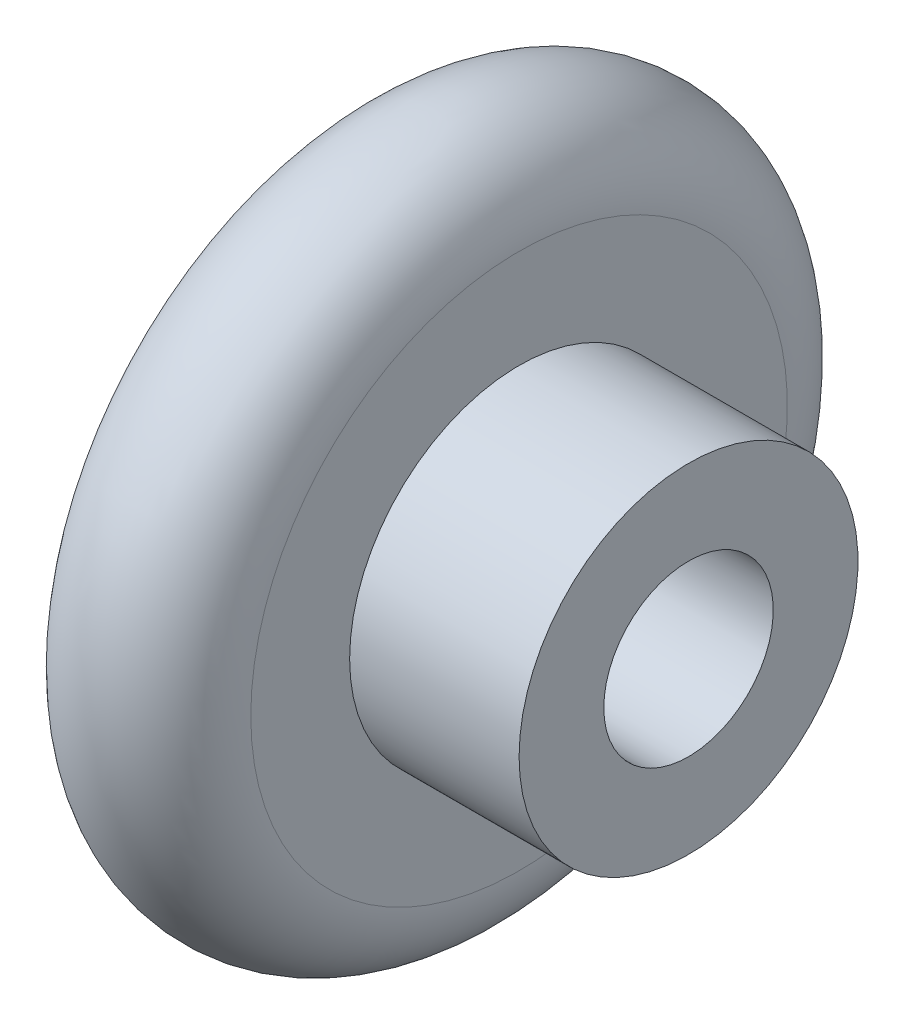
ISO-10303-21;
HEADER;
FILE_DESCRIPTION(('STEP AP214'),'2;1');
FILE_NAME('part.step','',(''),(''),'','','');
FILE_SCHEMA(('AUTOMOTIVE_DESIGN { 1 0 10303 214 1 1 1 1 }'));
ENDSEC;
DATA;
#1=APPLICATION_CONTEXT('core data for automotive mechanical design processes');
#2=APPLICATION_PROTOCOL_DEFINITION('international standard','automotive_design',2000,#1);
#3=PRODUCT_CONTEXT('',#1,'mechanical');
#4=PRODUCT('Part','Part','',(#3));
#5=PRODUCT_RELATED_PRODUCT_CATEGORY('part','',(#4));
#6=PRODUCT_DEFINITION_FORMATION('','',#4);
#7=PRODUCT_DEFINITION_CONTEXT('part definition',#1,'design');
#8=PRODUCT_DEFINITION('design','',#6,#7);
#9=PRODUCT_DEFINITION_SHAPE('','',#8);
#10=(LENGTH_UNIT() NAMED_UNIT(*) SI_UNIT(.MILLI.,.METRE.));
#11=(NAMED_UNIT(*) PLANE_ANGLE_UNIT() SI_UNIT($,.RADIAN.));
#12=(NAMED_UNIT(*) SI_UNIT($,.STERADIAN.) SOLID_ANGLE_UNIT());
#13=UNCERTAINTY_MEASURE_WITH_UNIT(LENGTH_MEASURE(1.E-05),#10,'distance_accuracy_value','');
#14=(GEOMETRIC_REPRESENTATION_CONTEXT(3) GLOBAL_UNCERTAINTY_ASSIGNED_CONTEXT((#13)) GLOBAL_UNIT_ASSIGNED_CONTEXT((#10,
#11,#12)) REPRESENTATION_CONTEXT('',''));
#15=CARTESIAN_POINT('',(0.,0.,0.));
#16=DIRECTION('',(0.,0.,1.));
#17=DIRECTION('',(1.,0.,0.));
#18=AXIS2_PLACEMENT_3D('',#15,#16,#17);
#19=CARTESIAN_POINT('',(0.,9.5,0.));
#20=DIRECTION('',(1.,0.,0.));
#21=DIRECTION('',(0.,0.,-1.));
#22=AXIS2_PLACEMENT_3D('',#19,#20,#21);
#23=PLANE('',#22);
#24=CARTESIAN_POINT('',(0.,0.,0.));
#25=DIRECTION('',(-1.,0.,0.));
#26=DIRECTION('',(0.,0.,1.));
#27=AXIS2_PLACEMENT_3D('',#24,#25,#26);
#28=CIRCLE('',#27,3.);
#29=CARTESIAN_POINT('',(0.,0.,3.));
#30=VERTEX_POINT('',#29);
#31=EDGE_CURVE('E10',#30,#30,#28,.T.);
#32=ORIENTED_EDGE('',*,*,#31,.F.);
#33=EDGE_LOOP('',(#32));
#34=FACE_BOUND('',#33,.T.);
#35=CARTESIAN_POINT('',(0.,0.,0.));
#36=DIRECTION('',(-1.,0.,0.));
#37=DIRECTION('',(0.,0.,1.));
#38=AXIS2_PLACEMENT_3D('',#35,#36,#37);
#39=CIRCLE('',#38,9.5);
#40=CARTESIAN_POINT('',(0.,0.,9.5));
#41=VERTEX_POINT('',#40);
#42=EDGE_CURVE('E56',#41,#41,#39,.T.);
#43=ORIENTED_EDGE('',*,*,#42,.T.);
#44=EDGE_LOOP('',(#43));
#45=FACE_BOUND('',#44,.T.);
#46=ADVANCED_FACE('F34',(#34,#45),#23,.F.);
#47=CARTESIAN_POINT('',(0.,0.,0.));
#48=DIRECTION('',(-1.,0.,0.));
#49=DIRECTION('',(0.,0.,1.));
#50=AXIS2_PLACEMENT_3D('',#47,#48,#49);
#51=CYLINDRICAL_SURFACE('',#50,3.);
#52=CARTESIAN_POINT('',(12.,0.,0.));
#53=DIRECTION('',(-1.,0.,0.));
#54=DIRECTION('',(0.,0.,1.));
#55=AXIS2_PLACEMENT_3D('',#52,#53,#54);
#56=CIRCLE('',#55,3.);
#57=CARTESIAN_POINT('',(12.,0.,3.));
#58=VERTEX_POINT('',#57);
#59=EDGE_CURVE('E40',#58,#58,#56,.T.);
#60=ORIENTED_EDGE('',*,*,#59,.F.);
#61=EDGE_LOOP('',(#60));
#62=FACE_BOUND('',#61,.T.);
#63=ORIENTED_EDGE('',*,*,#31,.T.);
#64=EDGE_LOOP('',(#63));
#65=FACE_BOUND('',#64,.T.);
#66=ADVANCED_FACE('F81',(#62,#65),#51,.F.);
#67=CARTESIAN_POINT('',(12.,3.,0.));
#68=DIRECTION('',(-1.,0.,0.));
#69=DIRECTION('',(0.,0.,1.));
#70=AXIS2_PLACEMENT_3D('',#67,#68,#69);
#71=PLANE('',#70);
#72=CARTESIAN_POINT('',(12.,0.,0.));
#73=DIRECTION('',(-1.,0.,0.));
#74=DIRECTION('',(0.,0.,1.));
#75=AXIS2_PLACEMENT_3D('',#72,#73,#74);
#76=CIRCLE('',#75,6.);
#77=CARTESIAN_POINT('',(12.,0.,6.));
#78=VERTEX_POINT('',#77);
#79=EDGE_CURVE('E44',#78,#78,#76,.T.);
#80=ORIENTED_EDGE('',*,*,#79,.F.);
#81=EDGE_LOOP('',(#80));
#82=FACE_BOUND('',#81,.T.);
#83=ORIENTED_EDGE('',*,*,#59,.T.);
#84=EDGE_LOOP('',(#83));
#85=FACE_BOUND('',#84,.T.);
#86=ADVANCED_FACE('F76',(#82,#85),#71,.F.);
#87=CARTESIAN_POINT('',(0.,0.,0.));
#88=DIRECTION('',(-1.,0.,0.));
#89=DIRECTION('',(0.,0.,1.));
#90=AXIS2_PLACEMENT_3D('',#87,#88,#89);
#91=CYLINDRICAL_SURFACE('',#90,6.);
#92=CARTESIAN_POINT('',(6.,0.,0.));
#93=DIRECTION('',(-1.,0.,0.));
#94=DIRECTION('',(0.,0.,1.));
#95=AXIS2_PLACEMENT_3D('',#92,#93,#94);
#96=CIRCLE('',#95,6.);
#97=CARTESIAN_POINT('',(6.,0.,6.));
#98=VERTEX_POINT('',#97);
#99=EDGE_CURVE('E48',#98,#98,#96,.T.);
#100=ORIENTED_EDGE('',*,*,#99,.F.);
#101=EDGE_LOOP('',(#100));
#102=FACE_BOUND('',#101,.T.);
#103=ORIENTED_EDGE('',*,*,#79,.T.);
#104=EDGE_LOOP('',(#103));
#105=FACE_BOUND('',#104,.T.);
#106=ADVANCED_FACE('F70',(#102,#105),#91,.T.);
#107=CARTESIAN_POINT('',(6.,6.,0.));
#108=DIRECTION('',(-1.,0.,0.));
#109=DIRECTION('',(0.,0.,1.));
#110=AXIS2_PLACEMENT_3D('',#107,#108,#109);
#111=PLANE('',#110);
#112=CARTESIAN_POINT('',(6.,0.,0.));
#113=DIRECTION('',(-1.,0.,0.));
#114=DIRECTION('',(0.,0.,1.));
#115=AXIS2_PLACEMENT_3D('',#112,#113,#114);
#116=CIRCLE('',#115,9.5);
#117=CARTESIAN_POINT('',(6.,0.,9.5));
#118=VERTEX_POINT('',#117);
#119=EDGE_CURVE('E53',#118,#118,#116,.T.);
#120=ORIENTED_EDGE('',*,*,#119,.F.);
#121=EDGE_LOOP('',(#120));
#122=FACE_BOUND('',#121,.T.);
#123=ORIENTED_EDGE('',*,*,#99,.T.);
#124=EDGE_LOOP('',(#123));
#125=FACE_BOUND('',#124,.T.);
#126=ADVANCED_FACE('F64',(#122,#125),#111,.F.);
#127=CARTESIAN_POINT('',(3.,0.,0.));
#128=DIRECTION('',(-1.,0.,0.));
#129=DIRECTION('',(0.,0.,1.));
#130=AXIS2_PLACEMENT_3D('',#127,#128,#129);
#131=TOROIDAL_SURFACE('',#130,9.5,3.);
#132=ORIENTED_EDGE('',*,*,#42,.F.);
#133=EDGE_LOOP('',(#132));
#134=FACE_BOUND('',#133,.T.);
#135=ORIENTED_EDGE('',*,*,#119,.T.);
#136=EDGE_LOOP('',(#135));
#137=FACE_BOUND('',#136,.T.);
#138=ADVANCED_FACE('F61',(#134,#137),#131,.T.);
#139=CLOSED_SHELL('',(#46,#66,#86,#106,#126,#138));
#140=MANIFOLD_SOLID_BREP('B2',#139);
#141=ADVANCED_BREP_SHAPE_REPRESENTATION('',(#18,#140),#14);
#142=SHAPE_DEFINITION_REPRESENTATION(#9,#141);
ENDSEC;
END-ISO-10303-21;
